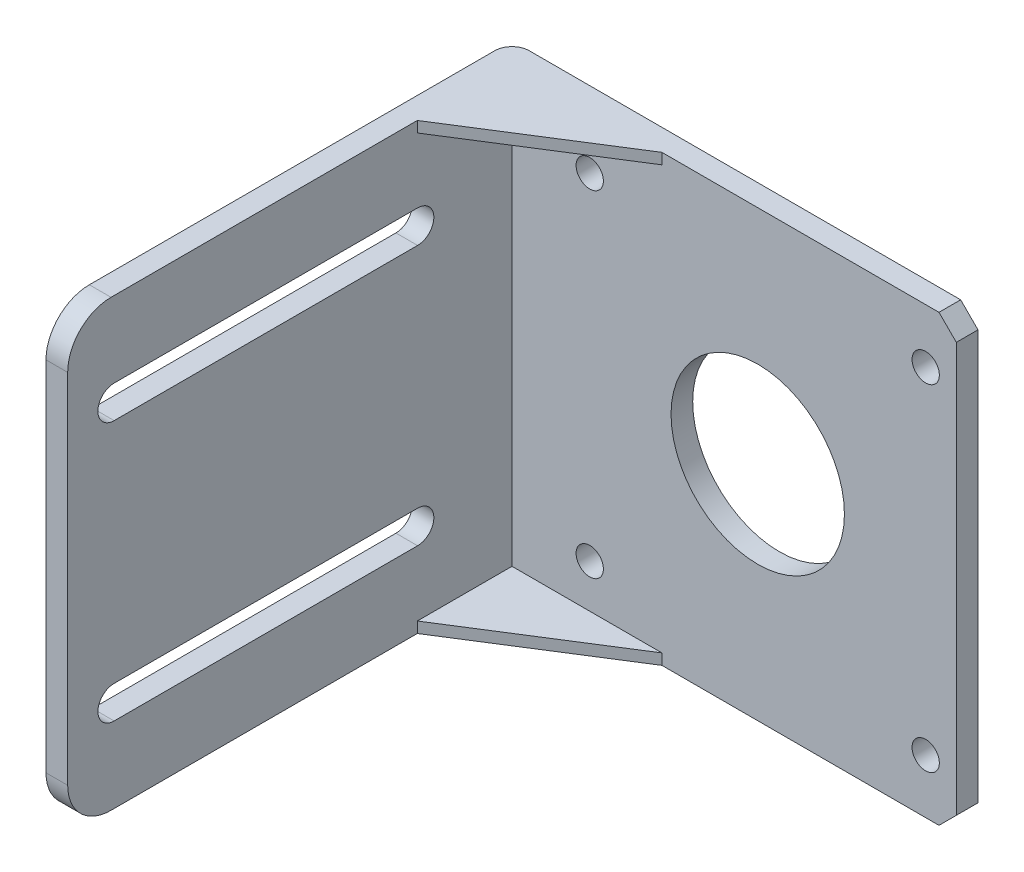
ISO-10303-21;
HEADER;
FILE_DESCRIPTION(('STEP AP214'),'2;1');
FILE_NAME('part.step','',(''),(''),'','','');
FILE_SCHEMA(('AUTOMOTIVE_DESIGN { 1 0 10303 214 1 1 1 1 }'));
ENDSEC;
DATA;
#1=APPLICATION_CONTEXT('core data for automotive mechanical design processes');
#2=APPLICATION_PROTOCOL_DEFINITION('international standard','automotive_design',2000,#1);
#3=PRODUCT_CONTEXT('',#1,'mechanical');
#4=PRODUCT('Part','Part','',(#3));
#5=PRODUCT_RELATED_PRODUCT_CATEGORY('part','',(#4));
#6=PRODUCT_DEFINITION_FORMATION('','',#4);
#7=PRODUCT_DEFINITION_CONTEXT('part definition',#1,'design');
#8=PRODUCT_DEFINITION('design','',#6,#7);
#9=PRODUCT_DEFINITION_SHAPE('','',#8);
#10=(LENGTH_UNIT() NAMED_UNIT(*) SI_UNIT(.MILLI.,.METRE.));
#11=(NAMED_UNIT(*) PLANE_ANGLE_UNIT() SI_UNIT($,.RADIAN.));
#12=(NAMED_UNIT(*) SI_UNIT($,.STERADIAN.) SOLID_ANGLE_UNIT());
#13=UNCERTAINTY_MEASURE_WITH_UNIT(LENGTH_MEASURE(1.E-05),#10,'distance_accuracy_value','');
#14=(GEOMETRIC_REPRESENTATION_CONTEXT(3) GLOBAL_UNCERTAINTY_ASSIGNED_CONTEXT((#13)) GLOBAL_UNIT_ASSIGNED_CONTEXT((#10,
#11,#12)) REPRESENTATION_CONTEXT('',''));
#15=CARTESIAN_POINT('',(0.,0.,0.));
#16=DIRECTION('',(0.,0.,1.));
#17=DIRECTION('',(1.,0.,0.));
#18=AXIS2_PLACEMENT_3D('',#15,#16,#17);
#19=CARTESIAN_POINT('',(-33.0738822992701,65.0875,-31.0808166058394));
#20=DIRECTION('',(-1.,0.,0.));
#21=DIRECTION('',(0.,0.,1.));
#22=AXIS2_PLACEMENT_3D('',#19,#20,#21);
#23=PLANE('',#22);
#24=DIRECTION('',(0.,0.,1.));
#25=VECTOR('',#24,1.);
#26=CARTESIAN_POINT('',(-33.0738822992701,53.975,-17.2504494782505));
#27=LINE('',#26,#25);
#28=CARTESIAN_POINT('',(-33.0738822992701,53.975,-17.2504494782506));
#29=VERTEX_POINT('',#28);
#30=CARTESIAN_POINT('',(-33.0738822992701,53.975,27.1995505217494));
#31=VERTEX_POINT('',#30);
#32=EDGE_CURVE('E834',#29,#31,#27,.T.);
#33=ORIENTED_EDGE('',*,*,#32,.F.);
#34=CARTESIAN_POINT('',(-33.0738822992701,51.59375,-17.2504494782506));
#35=DIRECTION('',(-1.,0.,0.));
#36=DIRECTION('',(0.,0.,1.));
#37=AXIS2_PLACEMENT_3D('',#34,#35,#36);
#38=CIRCLE('',#37,2.38125);
#39=CARTESIAN_POINT('',(-33.0738822992701,49.2125,-17.2504494782506));
#40=VERTEX_POINT('',#39);
#41=EDGE_CURVE('E238',#40,#29,#38,.F.);
#42=ORIENTED_EDGE('',*,*,#41,.F.);
#43=DIRECTION('',(0.,0.,-1.));
#44=VECTOR('',#43,1.);
#45=CARTESIAN_POINT('',(-33.0738822992701,49.2125,-17.2504494782505));
#46=LINE('',#45,#44);
#47=CARTESIAN_POINT('',(-33.0738822992701,49.2125,27.1995505217494));
#48=VERTEX_POINT('',#47);
#49=EDGE_CURVE('E234',#48,#40,#46,.T.);
#50=ORIENTED_EDGE('',*,*,#49,.F.);
#51=CARTESIAN_POINT('',(-33.0738822992701,51.59375,27.1995505217494));
#52=DIRECTION('',(-1.,0.,0.));
#53=DIRECTION('',(0.,0.,1.));
#54=AXIS2_PLACEMENT_3D('',#51,#52,#53);
#55=CIRCLE('',#54,2.38125);
#56=EDGE_CURVE('E201',#31,#48,#55,.F.);
#57=ORIENTED_EDGE('',*,*,#56,.F.);
#58=EDGE_LOOP('',(#33,#42,#50,#57));
#59=FACE_BOUND('',#58,.T.);
#60=DIRECTION('',(0.,0.,1.));
#61=VECTOR('',#60,1.);
#62=CARTESIAN_POINT('',(-33.0738822992701,15.875,-17.2504494782505));
#63=LINE('',#62,#61);
#64=CARTESIAN_POINT('',(-33.0738822992701,15.875,-17.2504494782505));
#65=VERTEX_POINT('',#64);
#66=CARTESIAN_POINT('',(-33.0738822992701,15.875,27.1995505217494));
#67=VERTEX_POINT('',#66);
#68=EDGE_CURVE('E242',#65,#67,#63,.T.);
#69=ORIENTED_EDGE('',*,*,#68,.F.);
#70=CARTESIAN_POINT('',(-33.0738822992701,13.49375,-17.2504494782505));
#71=DIRECTION('',(-1.,0.,0.));
#72=DIRECTION('',(0.,0.,1.));
#73=AXIS2_PLACEMENT_3D('',#70,#71,#72);
#74=CIRCLE('',#73,2.38125);
#75=CARTESIAN_POINT('',(-33.0738822992701,11.1125,-17.2504494782505));
#76=VERTEX_POINT('',#75);
#77=EDGE_CURVE('E246',#76,#65,#74,.F.);
#78=ORIENTED_EDGE('',*,*,#77,.F.);
#79=DIRECTION('',(0.,0.,-1.));
#80=VECTOR('',#79,1.);
#81=CARTESIAN_POINT('',(-33.0738822992701,11.1125,-17.2504494782505));
#82=LINE('',#81,#80);
#83=CARTESIAN_POINT('',(-33.0738822992701,11.1125,27.1995505217494));
#84=VERTEX_POINT('',#83);
#85=EDGE_CURVE('E249',#84,#76,#82,.T.);
#86=ORIENTED_EDGE('',*,*,#85,.F.);
#87=CARTESIAN_POINT('',(-33.0738822992701,13.49375,27.1995505217494));
#88=DIRECTION('',(-1.,0.,0.));
#89=DIRECTION('',(0.,0.,1.));
#90=AXIS2_PLACEMENT_3D('',#87,#88,#89);
#91=CIRCLE('',#90,2.38125);
#92=EDGE_CURVE('E239',#67,#84,#91,.F.);
#93=ORIENTED_EDGE('',*,*,#92,.F.);
#94=EDGE_LOOP('',(#69,#78,#86,#93));
#95=FACE_BOUND('',#94,.T.);
#96=DIRECTION('',(0.,-1.,0.));
#97=VECTOR('',#96,1.);
#98=CARTESIAN_POINT('',(-33.0738822992701,65.0875,-17.2110797637341));
#99=LINE('',#98,#97);
#100=CARTESIAN_POINT('',(-33.0738822992701,1.5875,-17.2110797637341));
#101=VERTEX_POINT('',#100);
#102=CARTESIAN_POINT('',(-33.0738822992701,0.,-17.2110797637341));
#103=VERTEX_POINT('',#102);
#104=EDGE_CURVE('E288',#101,#103,#99,.T.);
#105=ORIENTED_EDGE('',*,*,#104,.F.);
#106=DIRECTION('',(0.,0.,-1.));
#107=VECTOR('',#106,1.);
#108=CARTESIAN_POINT('',(-33.0738822992701,1.58750000000001,-31.0808166058394));
#109=LINE('',#108,#107);
#110=CARTESIAN_POINT('',(-33.0738822992701,1.58750000000001,-31.0808166058394));
#111=VERTEX_POINT('',#110);
#112=EDGE_CURVE('E292',#101,#111,#109,.T.);
#113=ORIENTED_EDGE('',*,*,#112,.T.);
#114=DIRECTION('',(0.,-1.,0.));
#115=VECTOR('',#114,1.);
#116=CARTESIAN_POINT('',(-33.0738822992701,65.0875,-31.0808166058394));
#117=LINE('',#116,#115);
#118=CARTESIAN_POINT('',(-33.0738822992701,63.5,-31.0808166058394));
#119=VERTEX_POINT('',#118);
#120=EDGE_CURVE('E450',#119,#111,#117,.T.);
#121=ORIENTED_EDGE('',*,*,#120,.F.);
#122=DIRECTION('',(0.,0.,1.));
#123=VECTOR('',#122,1.);
#124=CARTESIAN_POINT('',(-33.0738822992701,63.5,-31.0808166058394));
#125=LINE('',#124,#123);
#126=CARTESIAN_POINT('',(-33.0738822992701,63.5,-17.2110797637341));
#127=VERTEX_POINT('',#126);
#128=EDGE_CURVE('E310',#119,#127,#125,.T.);
#129=ORIENTED_EDGE('',*,*,#128,.T.);
#130=DIRECTION('',(0.,1.,0.));
#131=VECTOR('',#130,1.);
#132=CARTESIAN_POINT('',(-33.0738822992701,65.0875,-17.2110797637341));
#133=LINE('',#132,#131);
#134=CARTESIAN_POINT('',(-33.0738822992701,65.0875,-17.2110797637341));
#135=VERTEX_POINT('',#134);
#136=EDGE_CURVE('E306',#127,#135,#133,.T.);
#137=ORIENTED_EDGE('',*,*,#136,.T.);
#138=DIRECTION('',(0.,0.,-1.));
#139=VECTOR('',#138,1.);
#140=CARTESIAN_POINT('',(-33.0738822992701,65.0875,-31.0808166058394));
#141=LINE('',#140,#139);
#142=CARTESIAN_POINT('',(-33.0738822992701,65.0875,27.6566833941605));
#143=VERTEX_POINT('',#142);
#144=EDGE_CURVE('E420',#143,#135,#141,.T.);
#145=ORIENTED_EDGE('',*,*,#144,.F.);
#146=CARTESIAN_POINT('',(-33.0738822992701,58.7375,27.6566833941606));
#147=DIRECTION('',(-1.,0.,0.));
#148=DIRECTION('',(0.,0.,1.));
#149=AXIS2_PLACEMENT_3D('',#146,#147,#148);
#150=CIRCLE('',#149,6.35);
#151=CARTESIAN_POINT('',(-33.0738822992701,58.7375,34.0066833941606));
#152=VERTEX_POINT('',#151);
#153=EDGE_CURVE('E325',#152,#143,#150,.T.);
#154=ORIENTED_EDGE('',*,*,#153,.F.);
#155=DIRECTION('',(0.,-1.,0.));
#156=VECTOR('',#155,1.);
#157=CARTESIAN_POINT('',(-33.0738822992701,65.0875,34.0066833941606));
#158=LINE('',#157,#156);
#159=CARTESIAN_POINT('',(-33.0738822992701,6.35000000000004,34.0066833941606));
#160=VERTEX_POINT('',#159);
#161=EDGE_CURVE('E454',#152,#160,#158,.T.);
#162=ORIENTED_EDGE('',*,*,#161,.T.);
#163=CARTESIAN_POINT('',(-33.0738822992701,6.35,27.6566833941606));
#164=DIRECTION('',(-1.,0.,0.));
#165=DIRECTION('',(0.,0.,1.));
#166=AXIS2_PLACEMENT_3D('',#163,#164,#165);
#167=CIRCLE('',#166,6.35);
#168=CARTESIAN_POINT('',(-33.0738822992701,0.,27.6566833941605));
#169=VERTEX_POINT('',#168);
#170=EDGE_CURVE('E315',#169,#160,#167,.T.);
#171=ORIENTED_EDGE('',*,*,#170,.F.);
#172=DIRECTION('',(0.,0.,-1.));
#173=VECTOR('',#172,1.);
#174=CARTESIAN_POINT('',(-33.0738822992701,0.,-31.0808166058394));
#175=LINE('',#174,#173);
#176=EDGE_CURVE('E438',#169,#103,#175,.T.);
#177=ORIENTED_EDGE('',*,*,#176,.T.);
#178=EDGE_LOOP('',(#105,#113,#121,#129,#137,#145,#154,#162,#171,#177));
#179=FACE_BOUND('',#178,.T.);
#180=ADVANCED_FACE('F41',(#59,#95,#179),#23,.F.);
#181=CARTESIAN_POINT('',(32.0136177007299,65.0875,-31.0808166058394));
#182=DIRECTION('',(0.,0.,-1.));
#183=DIRECTION('',(-1.,0.,0.));
#184=AXIS2_PLACEMENT_3D('',#181,#182,#183);
#185=PLANE('',#184);
#186=CARTESIAN_POINT('',(27.5272904900613,57.15,-31.0808166058394));
#187=DIRECTION('',(0.,0.,-1.));
#188=DIRECTION('',(-1.,0.,0.));
#189=AXIS2_PLACEMENT_3D('',#186,#187,#188);
#190=CIRCLE('',#189,2.);
#191=CARTESIAN_POINT('',(25.5272904900613,57.15,-31.0808166058394));
#192=VERTEX_POINT('',#191);
#193=EDGE_CURVE('E378',#192,#192,#190,.F.);
#194=ORIENTED_EDGE('',*,*,#193,.F.);
#195=EDGE_LOOP('',(#194));
#196=FACE_BOUND('',#195,.T.);
#197=CARTESIAN_POINT('',(-21.6852095099387,57.15,-31.0808166058394));
#198=DIRECTION('',(0.,0.,-1.));
#199=DIRECTION('',(-1.,0.,0.));
#200=AXIS2_PLACEMENT_3D('',#197,#198,#199);
#201=CIRCLE('',#200,2.);
#202=CARTESIAN_POINT('',(-23.6852095099387,57.15,-31.0808166058394));
#203=VERTEX_POINT('',#202);
#204=EDGE_CURVE('E392',#203,#203,#201,.F.);
#205=ORIENTED_EDGE('',*,*,#204,.F.);
#206=EDGE_LOOP('',(#205));
#207=FACE_BOUND('',#206,.T.);
#208=CARTESIAN_POINT('',(-21.6852095099387,7.9375,-31.0808166058394));
#209=DIRECTION('',(0.,0.,-1.));
#210=DIRECTION('',(-1.,0.,0.));
#211=AXIS2_PLACEMENT_3D('',#208,#209,#210);
#212=CIRCLE('',#211,2.00000000000001);
#213=CARTESIAN_POINT('',(-23.6852095099387,7.9375,-31.0808166058394));
#214=VERTEX_POINT('',#213);
#215=EDGE_CURVE('E400',#214,#214,#212,.F.);
#216=ORIENTED_EDGE('',*,*,#215,.F.);
#217=EDGE_LOOP('',(#216));
#218=FACE_BOUND('',#217,.T.);
#219=CARTESIAN_POINT('',(27.5272904900613,7.9375,-31.0808166058394));
#220=DIRECTION('',(0.,0.,-1.));
#221=DIRECTION('',(-1.,0.,0.));
#222=AXIS2_PLACEMENT_3D('',#219,#220,#221);
#223=CIRCLE('',#222,2.);
#224=CARTESIAN_POINT('',(25.5272904900613,7.9375,-31.0808166058394));
#225=VERTEX_POINT('',#224);
#226=EDGE_CURVE('E362',#225,#225,#223,.F.);
#227=ORIENTED_EDGE('',*,*,#226,.F.);
#228=EDGE_LOOP('',(#227));
#229=FACE_BOUND('',#228,.T.);
#230=CARTESIAN_POINT('',(2.92104049006133,32.54375,-31.0808166058394));
#231=DIRECTION('',(0.,0.,-1.));
#232=DIRECTION('',(-1.,0.,0.));
#233=AXIS2_PLACEMENT_3D('',#230,#231,#232);
#234=CIRCLE('',#233,12.7);
#235=CARTESIAN_POINT('',(-9.77895950993867,32.54375,-31.0808166058394));
#236=VERTEX_POINT('',#235);
#237=EDGE_CURVE('E363',#236,#236,#234,.F.);
#238=ORIENTED_EDGE('',*,*,#237,.F.);
#239=EDGE_LOOP('',(#238));
#240=FACE_BOUND('',#239,.T.);
#241=DIRECTION('',(0.,1.,0.));
#242=VECTOR('',#241,1.);
#243=CARTESIAN_POINT('',(-11.1134656326034,65.0875,-31.0808166058394));
#244=LINE('',#243,#242);
#245=CARTESIAN_POINT('',(-11.1134656326034,0.,-31.0808166058394));
#246=VERTEX_POINT('',#245);
#247=CARTESIAN_POINT('',(-11.1134656326035,1.5875,-31.0808166058394));
#248=VERTEX_POINT('',#247);
#249=EDGE_CURVE('E281',#246,#248,#244,.T.);
#250=ORIENTED_EDGE('',*,*,#249,.F.);
#251=DIRECTION('',(1.,0.,0.));
#252=VECTOR('',#251,1.);
#253=CARTESIAN_POINT('',(32.0136177007299,0.,-31.0808166058394));
#254=LINE('',#253,#252);
#255=CARTESIAN_POINT('',(29.4736177007299,0.,-31.0808166058394));
#256=VERTEX_POINT('',#255);
#257=EDGE_CURVE('E414',#246,#256,#254,.T.);
#258=ORIENTED_EDGE('',*,*,#257,.T.);
#259=DIRECTION('',(-0.707106781186548,-0.707106781186547,0.));
#260=VECTOR('',#259,1.);
#261=CARTESIAN_POINT('',(29.4736177007299,0.,-31.0808166058394));
#262=LINE('',#261,#260);
#263=CARTESIAN_POINT('',(32.0136177007299,2.54,-31.0808166058394));
#264=VERTEX_POINT('',#263);
#265=EDGE_CURVE('E352',#264,#256,#262,.T.);
#266=ORIENTED_EDGE('',*,*,#265,.F.);
#267=DIRECTION('',(0.,-1.,0.));
#268=VECTOR('',#267,1.);
#269=CARTESIAN_POINT('',(32.0136177007299,65.0875,-31.0808166058394));
#270=LINE('',#269,#268);
#271=CARTESIAN_POINT('',(32.0136177007299,62.5475,-31.0808166058394));
#272=VERTEX_POINT('',#271);
#273=EDGE_CURVE('E446',#272,#264,#270,.T.);
#274=ORIENTED_EDGE('',*,*,#273,.F.);
#275=DIRECTION('',(0.707106781186548,-0.707106781186548,0.));
#276=VECTOR('',#275,1.);
#277=CARTESIAN_POINT('',(29.4736177007299,65.0875,-31.0808166058394));
#278=LINE('',#277,#276);
#279=CARTESIAN_POINT('',(29.4736177007299,65.0875,-31.0808166058394));
#280=VERTEX_POINT('',#279);
#281=EDGE_CURVE('E343',#280,#272,#278,.T.);
#282=ORIENTED_EDGE('',*,*,#281,.F.);
#283=DIRECTION('',(1.,0.,0.));
#284=VECTOR('',#283,1.);
#285=CARTESIAN_POINT('',(32.0136177007299,65.0875,-31.0808166058394));
#286=LINE('',#285,#284);
#287=CARTESIAN_POINT('',(-11.1134656326034,65.0875,-31.0808166058394));
#288=VERTEX_POINT('',#287);
#289=EDGE_CURVE('E424',#288,#280,#286,.T.);
#290=ORIENTED_EDGE('',*,*,#289,.F.);
#291=DIRECTION('',(0.,-1.,0.));
#292=VECTOR('',#291,1.);
#293=CARTESIAN_POINT('',(-11.1134656326034,65.0875,-31.0808166058394));
#294=LINE('',#293,#292);
#295=CARTESIAN_POINT('',(-11.1134656326035,63.5,-31.0808166058394));
#296=VERTEX_POINT('',#295);
#297=EDGE_CURVE('E300',#288,#296,#294,.T.);
#298=ORIENTED_EDGE('',*,*,#297,.T.);
#299=DIRECTION('',(-1.,0.,0.));
#300=VECTOR('',#299,1.);
#301=CARTESIAN_POINT('',(32.0136177007299,63.5,-31.0808166058394));
#302=LINE('',#301,#300);
#303=EDGE_CURVE('E50',#296,#119,#302,.T.);
#304=ORIENTED_EDGE('',*,*,#303,.T.);
#305=ORIENTED_EDGE('',*,*,#120,.T.);
#306=DIRECTION('',(1.,0.,0.));
#307=VECTOR('',#306,1.);
#308=CARTESIAN_POINT('',(32.0136177007299,1.58750000000001,-31.0808166058394));
#309=LINE('',#308,#307);
#310=EDGE_CURVE('E11',#111,#248,#309,.T.);
#311=ORIENTED_EDGE('',*,*,#310,.T.);
#312=EDGE_LOOP('',(#250,#258,#266,#274,#282,#290,#298,#304,#305,#311));
#313=FACE_BOUND('',#312,.T.);
#314=ADVANCED_FACE('F472',(#196,#207,#218,#229,#240,#313),#185,.F.);
#315=CARTESIAN_POINT('',(-33.0738822992701,65.0875,34.0066833941606));
#316=DIRECTION('',(0.,0.,-1.));
#317=DIRECTION('',(-1.,0.,0.));
#318=AXIS2_PLACEMENT_3D('',#315,#316,#317);
#319=PLANE('',#318);
#320=DIRECTION('',(0.,-1.,0.));
#321=VECTOR('',#320,1.);
#322=CARTESIAN_POINT('',(-36.2488822992701,65.0875,34.0066833941606));
#323=LINE('',#322,#321);
#324=CARTESIAN_POINT('',(-36.2488822992701,58.7374999999999,34.0066833941606));
#325=VERTEX_POINT('',#324);
#326=CARTESIAN_POINT('',(-36.2488822992701,6.35000000000004,34.0066833941606));
#327=VERTEX_POINT('',#326);
#328=EDGE_CURVE('E458',#325,#327,#323,.T.);
#329=ORIENTED_EDGE('',*,*,#328,.T.);
#330=DIRECTION('',(-1.,0.,0.));
#331=VECTOR('',#330,1.);
#332=CARTESIAN_POINT('',(-24.0936261782009,6.35000000000004,34.0066833941606));
#333=LINE('',#332,#331);
#334=EDGE_CURVE('E324',#160,#327,#333,.T.);
#335=ORIENTED_EDGE('',*,*,#334,.F.);
#336=ORIENTED_EDGE('',*,*,#161,.F.);
#337=DIRECTION('',(-1.,0.,0.));
#338=VECTOR('',#337,1.);
#339=CARTESIAN_POINT('',(-24.0936261782009,58.7374999999999,34.0066833941606));
#340=LINE('',#339,#338);
#341=EDGE_CURVE('E333',#152,#325,#340,.T.);
#342=ORIENTED_EDGE('',*,*,#341,.T.);
#343=EDGE_LOOP('',(#329,#335,#336,#342));
#344=FACE_BOUND('',#343,.T.);
#345=ADVANCED_FACE('F536',(#344),#319,.F.);
#346=CARTESIAN_POINT('',(-33.7088822992701,65.0875,-34.2558166058394));
#347=DIRECTION('',(0.,0.,1.));
#348=DIRECTION('',(1.,0.,0.));
#349=AXIS2_PLACEMENT_3D('',#346,#347,#348);
#350=PLANE('',#349);
#351=DIRECTION('',(-1.,0.,0.));
#352=VECTOR('',#351,1.);
#353=CARTESIAN_POINT('',(-33.7088822992701,0.,-34.2558166058394));
#354=LINE('',#353,#352);
#355=CARTESIAN_POINT('',(29.4736177007299,0.,-34.2558166058394));
#356=VERTEX_POINT('',#355);
#357=CARTESIAN_POINT('',(-33.7088822992701,0.,-34.2558166058394));
#358=VERTEX_POINT('',#357);
#359=EDGE_CURVE('E346',#356,#358,#354,.T.);
#360=ORIENTED_EDGE('',*,*,#359,.T.);
#361=DIRECTION('',(0.,-1.,0.));
#362=VECTOR('',#361,1.);
#363=CARTESIAN_POINT('',(-33.7088822992701,65.0875,-34.2558166058394));
#364=LINE('',#363,#362);
#365=CARTESIAN_POINT('',(-33.7088822992701,65.0875,-34.2558166058394));
#366=VERTEX_POINT('',#365);
#367=EDGE_CURVE('E465',#366,#358,#364,.T.);
#368=ORIENTED_EDGE('',*,*,#367,.F.);
#369=DIRECTION('',(-1.,0.,0.));
#370=VECTOR('',#369,1.);
#371=CARTESIAN_POINT('',(-33.7088822992701,65.0875,-34.2558166058394));
#372=LINE('',#371,#370);
#373=CARTESIAN_POINT('',(29.4736177007299,65.0875,-34.2558166058394));
#374=VERTEX_POINT('',#373);
#375=EDGE_CURVE('E410',#374,#366,#372,.T.);
#376=ORIENTED_EDGE('',*,*,#375,.F.);
#377=DIRECTION('',(-0.707106781186548,0.707106781186548,0.));
#378=VECTOR('',#377,1.);
#379=CARTESIAN_POINT('',(29.4736177007299,65.0875,-34.2558166058394));
#380=LINE('',#379,#378);
#381=CARTESIAN_POINT('',(32.0136177007299,62.5475,-34.2558166058394));
#382=VERTEX_POINT('',#381);
#383=EDGE_CURVE('E348',#382,#374,#380,.T.);
#384=ORIENTED_EDGE('',*,*,#383,.F.);
#385=DIRECTION('',(0.,-1.,0.));
#386=VECTOR('',#385,1.);
#387=CARTESIAN_POINT('',(32.0136177007299,65.0875,-34.2558166058394));
#388=LINE('',#387,#386);
#389=CARTESIAN_POINT('',(32.0136177007299,2.54,-34.2558166058394));
#390=VERTEX_POINT('',#389);
#391=EDGE_CURVE('E427',#382,#390,#388,.T.);
#392=ORIENTED_EDGE('',*,*,#391,.T.);
#393=DIRECTION('',(0.707106781186548,0.707106781186547,0.));
#394=VECTOR('',#393,1.);
#395=CARTESIAN_POINT('',(29.4736177007299,0.,-34.2558166058394));
#396=LINE('',#395,#394);
#397=EDGE_CURVE('E374',#356,#390,#396,.T.);
#398=ORIENTED_EDGE('',*,*,#397,.F.);
#399=EDGE_LOOP('',(#360,#368,#376,#384,#392,#398));
#400=FACE_BOUND('',#399,.T.);
#401=CARTESIAN_POINT('',(27.5272904900613,57.15,-34.2558166058394));
#402=DIRECTION('',(0.,0.,-1.));
#403=DIRECTION('',(-1.,0.,0.));
#404=AXIS2_PLACEMENT_3D('',#401,#402,#403);
#405=CIRCLE('',#404,2.);
#406=CARTESIAN_POINT('',(25.5272904900613,57.15,-34.2558166058394));
#407=VERTEX_POINT('',#406);
#408=EDGE_CURVE('E388',#407,#407,#405,.T.);
#409=ORIENTED_EDGE('',*,*,#408,.F.);
#410=EDGE_LOOP('',(#409));
#411=FACE_BOUND('',#410,.T.);
#412=CARTESIAN_POINT('',(-21.6852095099387,57.15,-34.2558166058394));
#413=DIRECTION('',(0.,0.,-1.));
#414=DIRECTION('',(-1.,0.,0.));
#415=AXIS2_PLACEMENT_3D('',#412,#413,#414);
#416=CIRCLE('',#415,2.);
#417=CARTESIAN_POINT('',(-23.6852095099387,57.15,-34.2558166058394));
#418=VERTEX_POINT('',#417);
#419=EDGE_CURVE('E396',#418,#418,#416,.T.);
#420=ORIENTED_EDGE('',*,*,#419,.F.);
#421=EDGE_LOOP('',(#420));
#422=FACE_BOUND('',#421,.T.);
#423=CARTESIAN_POINT('',(-21.6852095099387,7.9375,-34.2558166058394));
#424=DIRECTION('',(0.,0.,-1.));
#425=DIRECTION('',(-1.,0.,0.));
#426=AXIS2_PLACEMENT_3D('',#423,#424,#425);
#427=CIRCLE('',#426,2.00000000000001);
#428=CARTESIAN_POINT('',(-23.6852095099387,7.9375,-34.2558166058394));
#429=VERTEX_POINT('',#428);
#430=EDGE_CURVE('E367',#429,#429,#427,.T.);
#431=ORIENTED_EDGE('',*,*,#430,.F.);
#432=EDGE_LOOP('',(#431));
#433=FACE_BOUND('',#432,.T.);
#434=CARTESIAN_POINT('',(27.5272904900613,7.9375,-34.2558166058394));
#435=DIRECTION('',(0.,0.,-1.));
#436=DIRECTION('',(-1.,0.,0.));
#437=AXIS2_PLACEMENT_3D('',#434,#435,#436);
#438=CIRCLE('',#437,2.);
#439=CARTESIAN_POINT('',(25.5272904900613,7.9375,-34.2558166058394));
#440=VERTEX_POINT('',#439);
#441=EDGE_CURVE('E358',#440,#440,#438,.T.);
#442=ORIENTED_EDGE('',*,*,#441,.F.);
#443=EDGE_LOOP('',(#442));
#444=FACE_BOUND('',#443,.T.);
#445=CARTESIAN_POINT('',(2.92104049006133,32.54375,-34.2558166058394));
#446=DIRECTION('',(0.,0.,-1.));
#447=DIRECTION('',(-1.,0.,0.));
#448=AXIS2_PLACEMENT_3D('',#445,#446,#447);
#449=CIRCLE('',#448,12.7);
#450=CARTESIAN_POINT('',(-9.77895950993867,32.54375,-34.2558166058394));
#451=VERTEX_POINT('',#450);
#452=EDGE_CURVE('E318',#451,#451,#449,.T.);
#453=ORIENTED_EDGE('',*,*,#452,.F.);
#454=EDGE_LOOP('',(#453));
#455=FACE_BOUND('',#454,.T.);
#456=ADVANCED_FACE('F43',(#400,#411,#422,#433,#444,#455),#350,.F.);
#457=CARTESIAN_POINT('',(-33.7088822992701,65.0875,-31.7158166058394));
#458=DIRECTION('',(0.,-1.,0.));
#459=DIRECTION('',(0.,0.,-1.));
#460=AXIS2_PLACEMENT_3D('',#457,#458,#459);
#461=CYLINDRICAL_SURFACE('',#460,2.54);
#462=ORIENTED_EDGE('',*,*,#367,.T.);
#463=CARTESIAN_POINT('',(-33.7088822992701,0.,-31.7158166058394));
#464=DIRECTION('',(0.,1.,0.));
#465=DIRECTION('',(0.,0.,-1.));
#466=AXIS2_PLACEMENT_3D('',#463,#464,#465);
#467=CIRCLE('',#466,2.54);
#468=CARTESIAN_POINT('',(-36.2488822992701,0.,-31.7158166058394));
#469=VERTEX_POINT('',#468);
#470=EDGE_CURVE('E431',#358,#469,#467,.T.);
#471=ORIENTED_EDGE('',*,*,#470,.T.);
#472=DIRECTION('',(0.,-1.,0.));
#473=VECTOR('',#472,1.);
#474=CARTESIAN_POINT('',(-36.2488822992701,65.0875,-31.7158166058394));
#475=LINE('',#474,#473);
#476=CARTESIAN_POINT('',(-36.2488822992701,65.0875,-31.7158166058394));
#477=VERTEX_POINT('',#476);
#478=EDGE_CURVE('E462',#477,#469,#475,.T.);
#479=ORIENTED_EDGE('',*,*,#478,.F.);
#480=CARTESIAN_POINT('',(-33.7088822992701,65.0875,-31.7158166058394));
#481=DIRECTION('',(0.,1.,0.));
#482=DIRECTION('',(0.,0.,-1.));
#483=AXIS2_PLACEMENT_3D('',#480,#481,#482);
#484=CIRCLE('',#483,2.54);
#485=EDGE_CURVE('E413',#366,#477,#484,.T.);
#486=ORIENTED_EDGE('',*,*,#485,.F.);
#487=EDGE_LOOP('',(#462,#471,#479,#486));
#488=FACE_BOUND('',#487,.T.);
#489=ADVANCED_FACE('F547',(#488),#461,.T.);
#490=CARTESIAN_POINT('',(-36.2488822992701,65.0875,34.0066833941606));
#491=DIRECTION('',(1.,0.,0.));
#492=DIRECTION('',(0.,0.,-1.));
#493=AXIS2_PLACEMENT_3D('',#490,#491,#492);
#494=PLANE('',#493);
#495=DIRECTION('',(0.,0.,1.));
#496=VECTOR('',#495,1.);
#497=CARTESIAN_POINT('',(-36.2488822992701,49.2125,-17.2504494782506));
#498=LINE('',#497,#496);
#499=CARTESIAN_POINT('',(-36.2488822992701,49.2125,-17.2504494782506));
#500=VERTEX_POINT('',#499);
#501=CARTESIAN_POINT('',(-36.2488822992701,49.2125,27.1995505217494));
#502=VERTEX_POINT('',#501);
#503=EDGE_CURVE('E209',#500,#502,#498,.T.);
#504=ORIENTED_EDGE('',*,*,#503,.F.);
#505=CARTESIAN_POINT('',(-36.2488822992701,51.59375,-17.2504494782506));
#506=DIRECTION('',(-1.,0.,0.));
#507=DIRECTION('',(0.,0.,1.));
#508=AXIS2_PLACEMENT_3D('',#505,#506,#507);
#509=CIRCLE('',#508,2.38125);
#510=CARTESIAN_POINT('',(-36.2488822992701,53.975,-17.2504494782506));
#511=VERTEX_POINT('',#510);
#512=EDGE_CURVE('E215',#511,#500,#509,.T.);
#513=ORIENTED_EDGE('',*,*,#512,.F.);
#514=DIRECTION('',(0.,0.,-1.));
#515=VECTOR('',#514,1.);
#516=CARTESIAN_POINT('',(-36.2488822992701,53.975,-17.2504494782506));
#517=LINE('',#516,#515);
#518=CARTESIAN_POINT('',(-36.2488822992701,53.975,27.1995505217494));
#519=VERTEX_POINT('',#518);
#520=EDGE_CURVE('E220',#519,#511,#517,.T.);
#521=ORIENTED_EDGE('',*,*,#520,.F.);
#522=CARTESIAN_POINT('',(-36.2488822992701,51.59375,27.1995505217494));
#523=DIRECTION('',(-1.,0.,0.));
#524=DIRECTION('',(0.,0.,1.));
#525=AXIS2_PLACEMENT_3D('',#522,#523,#524);
#526=CIRCLE('',#525,2.38125);
#527=EDGE_CURVE('E198',#502,#519,#526,.T.);
#528=ORIENTED_EDGE('',*,*,#527,.F.);
#529=EDGE_LOOP('',(#504,#513,#521,#528));
#530=FACE_BOUND('',#529,.T.);
#531=DIRECTION('',(0.,0.,1.));
#532=VECTOR('',#531,1.);
#533=CARTESIAN_POINT('',(-36.2488822992701,11.1125,-17.2504494782505));
#534=LINE('',#533,#532);
#535=CARTESIAN_POINT('',(-36.2488822992701,11.1125,-17.2504494782505));
#536=VERTEX_POINT('',#535);
#537=CARTESIAN_POINT('',(-36.2488822992701,11.1125,27.1995505217494));
#538=VERTEX_POINT('',#537);
#539=EDGE_CURVE('E253',#536,#538,#534,.T.);
#540=ORIENTED_EDGE('',*,*,#539,.F.);
#541=CARTESIAN_POINT('',(-36.2488822992701,13.49375,-17.2504494782505));
#542=DIRECTION('',(-1.,0.,0.));
#543=DIRECTION('',(0.,0.,-1.));
#544=AXIS2_PLACEMENT_3D('',#541,#542,#543);
#545=CIRCLE('',#544,2.38125);
#546=CARTESIAN_POINT('',(-36.2488822992701,15.875,-17.2504494782505));
#547=VERTEX_POINT('',#546);
#548=EDGE_CURVE('E250',#547,#536,#545,.T.);
#549=ORIENTED_EDGE('',*,*,#548,.F.);
#550=DIRECTION('',(0.,0.,-1.));
#551=VECTOR('',#550,1.);
#552=CARTESIAN_POINT('',(-36.2488822992701,15.875,-17.2504494782505));
#553=LINE('',#552,#551);
#554=CARTESIAN_POINT('',(-36.2488822992701,15.875,27.1995505217494));
#555=VERTEX_POINT('',#554);
#556=EDGE_CURVE('E260',#555,#547,#553,.T.);
#557=ORIENTED_EDGE('',*,*,#556,.F.);
#558=CARTESIAN_POINT('',(-36.2488822992701,13.49375,27.1995505217494));
#559=DIRECTION('',(-1.,0.,0.));
#560=DIRECTION('',(0.,0.,-1.));
#561=AXIS2_PLACEMENT_3D('',#558,#559,#560);
#562=CIRCLE('',#561,2.38125);
#563=EDGE_CURVE('E256',#538,#555,#562,.T.);
#564=ORIENTED_EDGE('',*,*,#563,.F.);
#565=EDGE_LOOP('',(#540,#549,#557,#564));
#566=FACE_BOUND('',#565,.T.);
#567=DIRECTION('',(0.,0.,1.));
#568=VECTOR('',#567,1.);
#569=CARTESIAN_POINT('',(-36.2488822992701,0.,34.0066833941606));
#570=LINE('',#569,#568);
#571=CARTESIAN_POINT('',(-36.2488822992701,0.,27.6566833941605));
#572=VERTEX_POINT('',#571);
#573=EDGE_CURVE('E435',#469,#572,#570,.T.);
#574=ORIENTED_EDGE('',*,*,#573,.T.);
#575=CARTESIAN_POINT('',(-36.2488822992701,6.35,27.6566833941606));
#576=DIRECTION('',(1.,0.,0.));
#577=DIRECTION('',(0.,0.,-1.));
#578=AXIS2_PLACEMENT_3D('',#575,#576,#577);
#579=CIRCLE('',#578,6.35);
#580=EDGE_CURVE('E320',#327,#572,#579,.T.);
#581=ORIENTED_EDGE('',*,*,#580,.F.);
#582=ORIENTED_EDGE('',*,*,#328,.F.);
#583=CARTESIAN_POINT('',(-36.2488822992701,58.7375,27.6566833941606));
#584=DIRECTION('',(1.,0.,0.));
#585=DIRECTION('',(0.,0.,-1.));
#586=AXIS2_PLACEMENT_3D('',#583,#584,#585);
#587=CIRCLE('',#586,6.35);
#588=CARTESIAN_POINT('',(-36.2488822992701,65.0875,27.6566833941605));
#589=VERTEX_POINT('',#588);
#590=EDGE_CURVE('E314',#589,#325,#587,.T.);
#591=ORIENTED_EDGE('',*,*,#590,.F.);
#592=DIRECTION('',(0.,0.,1.));
#593=VECTOR('',#592,1.);
#594=CARTESIAN_POINT('',(-36.2488822992701,65.0875,34.0066833941606));
#595=LINE('',#594,#593);
#596=EDGE_CURVE('E417',#477,#589,#595,.T.);
#597=ORIENTED_EDGE('',*,*,#596,.F.);
#598=ORIENTED_EDGE('',*,*,#478,.T.);
#599=EDGE_LOOP('',(#574,#581,#582,#591,#597,#598));
#600=FACE_BOUND('',#599,.T.);
#601=ADVANCED_FACE('F217',(#530,#566,#600),#494,.F.);
#602=CARTESIAN_POINT('',(32.0136177007299,65.0875,-34.2558166058394));
#603=DIRECTION('',(-1.,0.,0.));
#604=DIRECTION('',(0.,0.,1.));
#605=AXIS2_PLACEMENT_3D('',#602,#603,#604);
#606=PLANE('',#605);
#607=ORIENTED_EDGE('',*,*,#391,.F.);
#608=DIRECTION('',(0.,0.,-1.));
#609=VECTOR('',#608,1.);
#610=CARTESIAN_POINT('',(32.0136177007299,62.5475,4.8402078784372));
#611=LINE('',#610,#609);
#612=EDGE_CURVE('E351',#272,#382,#611,.T.);
#613=ORIENTED_EDGE('',*,*,#612,.F.);
#614=ORIENTED_EDGE('',*,*,#273,.T.);
#615=DIRECTION('',(0.,0.,-1.));
#616=VECTOR('',#615,1.);
#617=CARTESIAN_POINT('',(32.0136177007299,2.54,4.8402078784372));
#618=LINE('',#617,#616);
#619=EDGE_CURVE('E379',#264,#390,#618,.T.);
#620=ORIENTED_EDGE('',*,*,#619,.T.);
#621=EDGE_LOOP('',(#607,#613,#614,#620));
#622=FACE_BOUND('',#621,.T.);
#623=ADVANCED_FACE('F504',(#622),#606,.F.);
#624=CARTESIAN_POINT('',(-33.7088822992701,65.0875,-31.7158166058394));
#625=DIRECTION('',(0.,-1.,0.));
#626=DIRECTION('',(0.,0.,-1.));
#627=AXIS2_PLACEMENT_3D('',#624,#625,#626);
#628=PLANE('',#627);
#629=ORIENTED_EDGE('',*,*,#144,.T.);
#630=DIRECTION('',(0.845488903030971,0.,-0.533992991387982));
#631=VECTOR('',#630,1.);
#632=CARTESIAN_POINT('',(-36.2488822992701,65.0875,-15.2058166058394));
#633=LINE('',#632,#631);
#634=EDGE_CURVE('E295',#135,#288,#633,.T.);
#635=ORIENTED_EDGE('',*,*,#634,.T.);
#636=ORIENTED_EDGE('',*,*,#289,.T.);
#637=DIRECTION('',(0.,0.,-1.));
#638=VECTOR('',#637,1.);
#639=CARTESIAN_POINT('',(29.4736177007299,65.0875,4.8402078784372));
#640=LINE('',#639,#638);
#641=EDGE_CURVE('E347',#280,#374,#640,.T.);
#642=ORIENTED_EDGE('',*,*,#641,.T.);
#643=ORIENTED_EDGE('',*,*,#375,.T.);
#644=ORIENTED_EDGE('',*,*,#485,.T.);
#645=ORIENTED_EDGE('',*,*,#596,.T.);
#646=DIRECTION('',(-1.,0.,0.));
#647=VECTOR('',#646,1.);
#648=CARTESIAN_POINT('',(-24.0936261782009,65.0875,27.6566833941605));
#649=LINE('',#648,#647);
#650=EDGE_CURVE('E336',#143,#589,#649,.T.);
#651=ORIENTED_EDGE('',*,*,#650,.F.);
#652=EDGE_LOOP('',(#629,#635,#636,#642,#643,#644,#645,#651));
#653=FACE_BOUND('',#652,.T.);
#654=ADVANCED_FACE('F511',(#653),#628,.F.);
#655=CARTESIAN_POINT('',(-33.7088822992701,0.,-31.7158166058394));
#656=DIRECTION('',(0.,-1.,0.));
#657=DIRECTION('',(0.,0.,-1.));
#658=AXIS2_PLACEMENT_3D('',#655,#656,#657);
#659=PLANE('',#658);
#660=DIRECTION('',(0.845488903030971,0.,-0.533992991387982));
#661=VECTOR('',#660,1.);
#662=CARTESIAN_POINT('',(-36.2488822992701,0.,-15.2058166058394));
#663=LINE('',#662,#661);
#664=EDGE_CURVE('E237',#103,#246,#663,.T.);
#665=ORIENTED_EDGE('',*,*,#664,.F.);
#666=ORIENTED_EDGE('',*,*,#176,.F.);
#667=DIRECTION('',(-1.,0.,0.));
#668=VECTOR('',#667,1.);
#669=CARTESIAN_POINT('',(-24.0936261782009,0.,27.6566833941605));
#670=LINE('',#669,#668);
#671=EDGE_CURVE('E319',#169,#572,#670,.T.);
#672=ORIENTED_EDGE('',*,*,#671,.T.);
#673=ORIENTED_EDGE('',*,*,#573,.F.);
#674=ORIENTED_EDGE('',*,*,#470,.F.);
#675=ORIENTED_EDGE('',*,*,#359,.F.);
#676=DIRECTION('',(0.,0.,-1.));
#677=VECTOR('',#676,1.);
#678=CARTESIAN_POINT('',(29.4736177007299,0.,4.8402078784372));
#679=LINE('',#678,#677);
#680=EDGE_CURVE('E377',#256,#356,#679,.T.);
#681=ORIENTED_EDGE('',*,*,#680,.F.);
#682=ORIENTED_EDGE('',*,*,#257,.F.);
#683=EDGE_LOOP('',(#665,#666,#672,#673,#674,#675,#681,#682));
#684=FACE_BOUND('',#683,.T.);
#685=ADVANCED_FACE('F494',(#684),#659,.T.);
#686=CARTESIAN_POINT('',(29.4736177007299,0.,4.8402078784372));
#687=DIRECTION('',(-0.707106781186547,0.707106781186548,0.));
#688=DIRECTION('',(-0.707106781186548,-0.707106781186547,0.));
#689=AXIS2_PLACEMENT_3D('',#686,#687,#688);
#690=PLANE('',#689);
#691=ORIENTED_EDGE('',*,*,#265,.T.);
#692=ORIENTED_EDGE('',*,*,#680,.T.);
#693=ORIENTED_EDGE('',*,*,#397,.T.);
#694=ORIENTED_EDGE('',*,*,#619,.F.);
#695=EDGE_LOOP('',(#691,#692,#693,#694));
#696=FACE_BOUND('',#695,.T.);
#697=ADVANCED_FACE('F491',(#696),#690,.F.);
#698=CARTESIAN_POINT('',(29.4736177007299,65.0875,4.8402078784372));
#699=DIRECTION('',(-0.707106781186548,-0.707106781186548,0.));
#700=DIRECTION('',(0.707106781186548,-0.707106781186548,0.));
#701=AXIS2_PLACEMENT_3D('',#698,#699,#700);
#702=PLANE('',#701);
#703=ORIENTED_EDGE('',*,*,#281,.T.);
#704=ORIENTED_EDGE('',*,*,#612,.T.);
#705=ORIENTED_EDGE('',*,*,#383,.T.);
#706=ORIENTED_EDGE('',*,*,#641,.F.);
#707=EDGE_LOOP('',(#703,#704,#705,#706));
#708=FACE_BOUND('',#707,.T.);
#709=ADVANCED_FACE('F509',(#708),#702,.F.);
#710=CARTESIAN_POINT('',(27.5272904900613,57.15,4.8402078784372));
#711=DIRECTION('',(0.,0.,-1.));
#712=DIRECTION('',(-1.,0.,0.));
#713=AXIS2_PLACEMENT_3D('',#710,#711,#712);
#714=CYLINDRICAL_SURFACE('',#713,2.);
#715=ORIENTED_EDGE('',*,*,#193,.T.);
#716=EDGE_LOOP('',(#715));
#717=FACE_BOUND('',#716,.T.);
#718=ORIENTED_EDGE('',*,*,#408,.T.);
#719=EDGE_LOOP('',(#718));
#720=FACE_BOUND('',#719,.T.);
#721=ADVANCED_FACE('F577',(#717,#720),#714,.F.);
#722=CARTESIAN_POINT('',(-21.6852095099387,57.15,4.8402078784372));
#723=DIRECTION('',(0.,0.,-1.));
#724=DIRECTION('',(-1.,0.,0.));
#725=AXIS2_PLACEMENT_3D('',#722,#723,#724);
#726=CYLINDRICAL_SURFACE('',#725,2.);
#727=ORIENTED_EDGE('',*,*,#204,.T.);
#728=EDGE_LOOP('',(#727));
#729=FACE_BOUND('',#728,.T.);
#730=ORIENTED_EDGE('',*,*,#419,.T.);
#731=EDGE_LOOP('',(#730));
#732=FACE_BOUND('',#731,.T.);
#733=ADVANCED_FACE('F586',(#729,#732),#726,.F.);
#734=CARTESIAN_POINT('',(-21.6852095099387,7.9375,4.8402078784372));
#735=DIRECTION('',(0.,0.,-1.));
#736=DIRECTION('',(-1.,0.,0.));
#737=AXIS2_PLACEMENT_3D('',#734,#735,#736);
#738=CYLINDRICAL_SURFACE('',#737,2.00000000000001);
#739=ORIENTED_EDGE('',*,*,#215,.T.);
#740=EDGE_LOOP('',(#739));
#741=FACE_BOUND('',#740,.T.);
#742=ORIENTED_EDGE('',*,*,#430,.T.);
#743=EDGE_LOOP('',(#742));
#744=FACE_BOUND('',#743,.T.);
#745=ADVANCED_FACE('F579',(#741,#744),#738,.F.);
#746=CARTESIAN_POINT('',(27.5272904900613,7.9375,4.8402078784372));
#747=DIRECTION('',(0.,0.,-1.));
#748=DIRECTION('',(-1.,0.,0.));
#749=AXIS2_PLACEMENT_3D('',#746,#747,#748);
#750=CYLINDRICAL_SURFACE('',#749,2.);
#751=ORIENTED_EDGE('',*,*,#226,.T.);
#752=EDGE_LOOP('',(#751));
#753=FACE_BOUND('',#752,.T.);
#754=ORIENTED_EDGE('',*,*,#441,.T.);
#755=EDGE_LOOP('',(#754));
#756=FACE_BOUND('',#755,.T.);
#757=ADVANCED_FACE('F571',(#753,#756),#750,.F.);
#758=CARTESIAN_POINT('',(2.92104049006133,32.54375,4.8402078784372));
#759=DIRECTION('',(0.,0.,-1.));
#760=DIRECTION('',(-1.,0.,0.));
#761=AXIS2_PLACEMENT_3D('',#758,#759,#760);
#762=CYLINDRICAL_SURFACE('',#761,12.7);
#763=ORIENTED_EDGE('',*,*,#237,.T.);
#764=EDGE_LOOP('',(#763));
#765=FACE_BOUND('',#764,.T.);
#766=ORIENTED_EDGE('',*,*,#452,.T.);
#767=EDGE_LOOP('',(#766));
#768=FACE_BOUND('',#767,.T.);
#769=ADVANCED_FACE('F566',(#765,#768),#762,.F.);
#770=CARTESIAN_POINT('',(-24.0936261782009,6.35,27.6566833941606));
#771=DIRECTION('',(-1.,0.,0.));
#772=DIRECTION('',(0.,0.,1.));
#773=AXIS2_PLACEMENT_3D('',#770,#771,#772);
#774=CYLINDRICAL_SURFACE('',#773,6.35);
#775=ORIENTED_EDGE('',*,*,#170,.T.);
#776=ORIENTED_EDGE('',*,*,#334,.T.);
#777=ORIENTED_EDGE('',*,*,#580,.T.);
#778=ORIENTED_EDGE('',*,*,#671,.F.);
#779=EDGE_LOOP('',(#775,#776,#777,#778));
#780=FACE_BOUND('',#779,.T.);
#781=ADVANCED_FACE('F526',(#780),#774,.T.);
#782=CARTESIAN_POINT('',(-24.0936261782009,58.7375,27.6566833941606));
#783=DIRECTION('',(-1.,0.,0.));
#784=DIRECTION('',(0.,0.,1.));
#785=AXIS2_PLACEMENT_3D('',#782,#783,#784);
#786=CYLINDRICAL_SURFACE('',#785,6.35);
#787=ORIENTED_EDGE('',*,*,#153,.T.);
#788=ORIENTED_EDGE('',*,*,#650,.T.);
#789=ORIENTED_EDGE('',*,*,#590,.T.);
#790=ORIENTED_EDGE('',*,*,#341,.F.);
#791=EDGE_LOOP('',(#787,#788,#789,#790));
#792=FACE_BOUND('',#791,.T.);
#793=ADVANCED_FACE('F519',(#792),#786,.T.);
#794=CARTESIAN_POINT('',(-33.7088822992701,63.5,-31.7158166058394));
#795=DIRECTION('',(0.,-1.,0.));
#796=DIRECTION('',(0.,0.,-1.));
#797=AXIS2_PLACEMENT_3D('',#794,#795,#796);
#798=PLANE('',#797);
#799=ORIENTED_EDGE('',*,*,#128,.F.);
#800=ORIENTED_EDGE('',*,*,#303,.F.);
#801=DIRECTION('',(0.845488903030971,0.,-0.533992991387982));
#802=VECTOR('',#801,1.);
#803=CARTESIAN_POINT('',(-36.2488822992701,63.5,-15.2058166058394));
#804=LINE('',#803,#802);
#805=EDGE_CURVE('E296',#127,#296,#804,.T.);
#806=ORIENTED_EDGE('',*,*,#805,.F.);
#807=EDGE_LOOP('',(#799,#800,#806));
#808=FACE_BOUND('',#807,.T.);
#809=ADVANCED_FACE('F517',(#808),#798,.T.);
#810=CARTESIAN_POINT('',(-36.2488822992701,63.5,-15.2058166058394));
#811=DIRECTION('',(0.533992991387982,0.,0.845488903030971));
#812=DIRECTION('',(0.845488903030971,0.,-0.533992991387982));
#813=AXIS2_PLACEMENT_3D('',#810,#811,#812);
#814=PLANE('',#813);
#815=ORIENTED_EDGE('',*,*,#136,.F.);
#816=ORIENTED_EDGE('',*,*,#805,.T.);
#817=ORIENTED_EDGE('',*,*,#297,.F.);
#818=ORIENTED_EDGE('',*,*,#634,.F.);
#819=EDGE_LOOP('',(#815,#816,#817,#818));
#820=FACE_BOUND('',#819,.T.);
#821=ADVANCED_FACE('F516',(#820),#814,.T.);
#822=CARTESIAN_POINT('',(-33.7088822992701,1.5875,-31.7158166058394));
#823=DIRECTION('',(0.,1.,0.));
#824=DIRECTION('',(0.,0.,-1.));
#825=AXIS2_PLACEMENT_3D('',#822,#823,#824);
#826=PLANE('',#825);
#827=ORIENTED_EDGE('',*,*,#112,.F.);
#828=DIRECTION('',(0.845488903030971,0.,-0.533992991387982));
#829=VECTOR('',#828,1.);
#830=CARTESIAN_POINT('',(-36.2488822992701,1.5875,-15.2058166058394));
#831=LINE('',#830,#829);
#832=EDGE_CURVE('E277',#101,#248,#831,.T.);
#833=ORIENTED_EDGE('',*,*,#832,.T.);
#834=ORIENTED_EDGE('',*,*,#310,.F.);
#835=EDGE_LOOP('',(#827,#833,#834));
#836=FACE_BOUND('',#835,.T.);
#837=ADVANCED_FACE('F482',(#836),#826,.T.);
#838=CARTESIAN_POINT('',(-36.2488822992701,1.5875,-15.2058166058394));
#839=DIRECTION('',(-0.533992991387982,0.,-0.845488903030971));
#840=DIRECTION('',(-0.845488903030971,0.,0.533992991387982));
#841=AXIS2_PLACEMENT_3D('',#838,#839,#840);
#842=PLANE('',#841);
#843=ORIENTED_EDGE('',*,*,#832,.F.);
#844=ORIENTED_EDGE('',*,*,#104,.T.);
#845=ORIENTED_EDGE('',*,*,#664,.T.);
#846=ORIENTED_EDGE('',*,*,#249,.T.);
#847=EDGE_LOOP('',(#843,#844,#845,#846));
#848=FACE_BOUND('',#847,.T.);
#849=ADVANCED_FACE('F484',(#848),#842,.F.);
#850=CARTESIAN_POINT('',(16.3685242208418,13.49375,-17.2504494782505));
#851=DIRECTION('',(-1.,0.,0.));
#852=DIRECTION('',(0.,0.,1.));
#853=AXIS2_PLACEMENT_3D('',#850,#851,#852);
#854=CYLINDRICAL_SURFACE('',#853,2.38125);
#855=ORIENTED_EDGE('',*,*,#77,.T.);
#856=DIRECTION('',(-1.,0.,0.));
#857=VECTOR('',#856,1.);
#858=CARTESIAN_POINT('',(16.3685242208418,15.875,-17.2504494782505));
#859=LINE('',#858,#857);
#860=EDGE_CURVE('E243',#65,#547,#859,.T.);
#861=ORIENTED_EDGE('',*,*,#860,.T.);
#862=ORIENTED_EDGE('',*,*,#548,.T.);
#863=DIRECTION('',(-1.,0.,0.));
#864=VECTOR('',#863,1.);
#865=CARTESIAN_POINT('',(16.3685242208418,11.1125,-17.2504494782505));
#866=LINE('',#865,#864);
#867=EDGE_CURVE('E264',#76,#536,#866,.T.);
#868=ORIENTED_EDGE('',*,*,#867,.F.);
#869=EDGE_LOOP('',(#855,#861,#862,#868));
#870=FACE_BOUND('',#869,.T.);
#871=ADVANCED_FACE('F727',(#870),#854,.F.);
#872=CARTESIAN_POINT('',(16.3685242208418,15.875,-17.2504494782505));
#873=DIRECTION('',(0.,1.,0.));
#874=DIRECTION('',(0.,0.,1.));
#875=AXIS2_PLACEMENT_3D('',#872,#873,#874);
#876=PLANE('',#875);
#877=ORIENTED_EDGE('',*,*,#68,.T.);
#878=DIRECTION('',(-1.,0.,0.));
#879=VECTOR('',#878,1.);
#880=CARTESIAN_POINT('',(16.3685242208418,15.875,27.1995505217494));
#881=LINE('',#880,#879);
#882=EDGE_CURVE('E267',#67,#555,#881,.T.);
#883=ORIENTED_EDGE('',*,*,#882,.T.);
#884=ORIENTED_EDGE('',*,*,#556,.T.);
#885=ORIENTED_EDGE('',*,*,#860,.F.);
#886=EDGE_LOOP('',(#877,#883,#884,#885));
#887=FACE_BOUND('',#886,.T.);
#888=ADVANCED_FACE('F747',(#887),#876,.F.);
#889=CARTESIAN_POINT('',(16.3685242208418,13.49375,27.1995505217494));
#890=DIRECTION('',(-1.,0.,0.));
#891=DIRECTION('',(0.,0.,1.));
#892=AXIS2_PLACEMENT_3D('',#889,#890,#891);
#893=CYLINDRICAL_SURFACE('',#892,2.38125);
#894=ORIENTED_EDGE('',*,*,#92,.T.);
#895=DIRECTION('',(-1.,0.,0.));
#896=VECTOR('',#895,1.);
#897=CARTESIAN_POINT('',(16.3685242208418,11.1125,27.1995505217494));
#898=LINE('',#897,#896);
#899=EDGE_CURVE('E65',#84,#538,#898,.T.);
#900=ORIENTED_EDGE('',*,*,#899,.T.);
#901=ORIENTED_EDGE('',*,*,#563,.T.);
#902=ORIENTED_EDGE('',*,*,#882,.F.);
#903=EDGE_LOOP('',(#894,#900,#901,#902));
#904=FACE_BOUND('',#903,.T.);
#905=ADVANCED_FACE('F758',(#904),#893,.F.);
#906=CARTESIAN_POINT('',(16.3685242208418,11.1125,-17.2504494782505));
#907=DIRECTION('',(0.,-1.,0.));
#908=DIRECTION('',(0.,0.,-1.));
#909=AXIS2_PLACEMENT_3D('',#906,#907,#908);
#910=PLANE('',#909);
#911=ORIENTED_EDGE('',*,*,#85,.T.);
#912=ORIENTED_EDGE('',*,*,#867,.T.);
#913=ORIENTED_EDGE('',*,*,#539,.T.);
#914=ORIENTED_EDGE('',*,*,#899,.F.);
#915=EDGE_LOOP('',(#911,#912,#913,#914));
#916=FACE_BOUND('',#915,.T.);
#917=ADVANCED_FACE('F769',(#916),#910,.F.);
#918=CARTESIAN_POINT('',(16.3685242208418,51.59375,-17.2504494782506));
#919=DIRECTION('',(-1.,0.,0.));
#920=DIRECTION('',(0.,0.,1.));
#921=AXIS2_PLACEMENT_3D('',#918,#919,#920);
#922=CYLINDRICAL_SURFACE('',#921,2.38125);
#923=ORIENTED_EDGE('',*,*,#41,.T.);
#924=DIRECTION('',(-1.,0.,0.));
#925=VECTOR('',#924,1.);
#926=CARTESIAN_POINT('',(16.3685242208418,53.975,-17.2504494782506));
#927=LINE('',#926,#925);
#928=EDGE_CURVE('E227',#29,#511,#927,.T.);
#929=ORIENTED_EDGE('',*,*,#928,.T.);
#930=ORIENTED_EDGE('',*,*,#512,.T.);
#931=DIRECTION('',(-1.,0.,0.));
#932=VECTOR('',#931,1.);
#933=CARTESIAN_POINT('',(16.3685242208418,49.2125,-17.2504494782506));
#934=LINE('',#933,#932);
#935=EDGE_CURVE('E205',#40,#500,#934,.T.);
#936=ORIENTED_EDGE('',*,*,#935,.F.);
#937=EDGE_LOOP('',(#923,#929,#930,#936));
#938=FACE_BOUND('',#937,.T.);
#939=ADVANCED_FACE('F780',(#938),#922,.F.);
#940=CARTESIAN_POINT('',(16.3685242208418,53.975,-17.2504494782506));
#941=DIRECTION('',(0.,1.,0.));
#942=DIRECTION('',(0.,0.,1.));
#943=AXIS2_PLACEMENT_3D('',#940,#941,#942);
#944=PLANE('',#943);
#945=ORIENTED_EDGE('',*,*,#32,.T.);
#946=DIRECTION('',(-1.,0.,0.));
#947=VECTOR('',#946,1.);
#948=CARTESIAN_POINT('',(16.3685242208418,53.975,27.1995505217494));
#949=LINE('',#948,#947);
#950=EDGE_CURVE('E204',#31,#519,#949,.T.);
#951=ORIENTED_EDGE('',*,*,#950,.T.);
#952=ORIENTED_EDGE('',*,*,#520,.T.);
#953=ORIENTED_EDGE('',*,*,#928,.F.);
#954=EDGE_LOOP('',(#945,#951,#952,#953));
#955=FACE_BOUND('',#954,.T.);
#956=ADVANCED_FACE('F790',(#955),#944,.F.);
#957=CARTESIAN_POINT('',(16.3685242208418,51.59375,27.1995505217494));
#958=DIRECTION('',(-1.,0.,0.));
#959=DIRECTION('',(0.,0.,1.));
#960=AXIS2_PLACEMENT_3D('',#957,#958,#959);
#961=CYLINDRICAL_SURFACE('',#960,2.38125);
#962=ORIENTED_EDGE('',*,*,#56,.T.);
#963=DIRECTION('',(-1.,0.,0.));
#964=VECTOR('',#963,1.);
#965=CARTESIAN_POINT('',(16.3685242208418,49.2125,27.1995505217494));
#966=LINE('',#965,#964);
#967=EDGE_CURVE('E57',#48,#502,#966,.T.);
#968=ORIENTED_EDGE('',*,*,#967,.T.);
#969=ORIENTED_EDGE('',*,*,#527,.T.);
#970=ORIENTED_EDGE('',*,*,#950,.F.);
#971=EDGE_LOOP('',(#962,#968,#969,#970));
#972=FACE_BOUND('',#971,.T.);
#973=ADVANCED_FACE('F195',(#972),#961,.F.);
#974=CARTESIAN_POINT('',(16.3685242208418,49.2125,-17.2504494782506));
#975=DIRECTION('',(0.,-1.,0.));
#976=DIRECTION('',(0.,0.,-1.));
#977=AXIS2_PLACEMENT_3D('',#974,#975,#976);
#978=PLANE('',#977);
#979=ORIENTED_EDGE('',*,*,#49,.T.);
#980=ORIENTED_EDGE('',*,*,#935,.T.);
#981=ORIENTED_EDGE('',*,*,#503,.T.);
#982=ORIENTED_EDGE('',*,*,#967,.F.);
#983=EDGE_LOOP('',(#979,#980,#981,#982));
#984=FACE_BOUND('',#983,.T.);
#985=ADVANCED_FACE('F210',(#984),#978,.F.);
#986=CLOSED_SHELL('',(#180,#314,#345,#456,#489,#601,#623,#654,#685,#697,#709,#721,#733,#745,
#757,#769,#781,#793,#809,#821,#837,#849,#871,#888,#905,#917,#939,#956,#973,#985));
#987=MANIFOLD_SOLID_BREP('B2',#986);
#988=ADVANCED_BREP_SHAPE_REPRESENTATION('',(#18,#987),#14);
#989=SHAPE_DEFINITION_REPRESENTATION(#9,#988);
ENDSEC;
END-ISO-10303-21;
